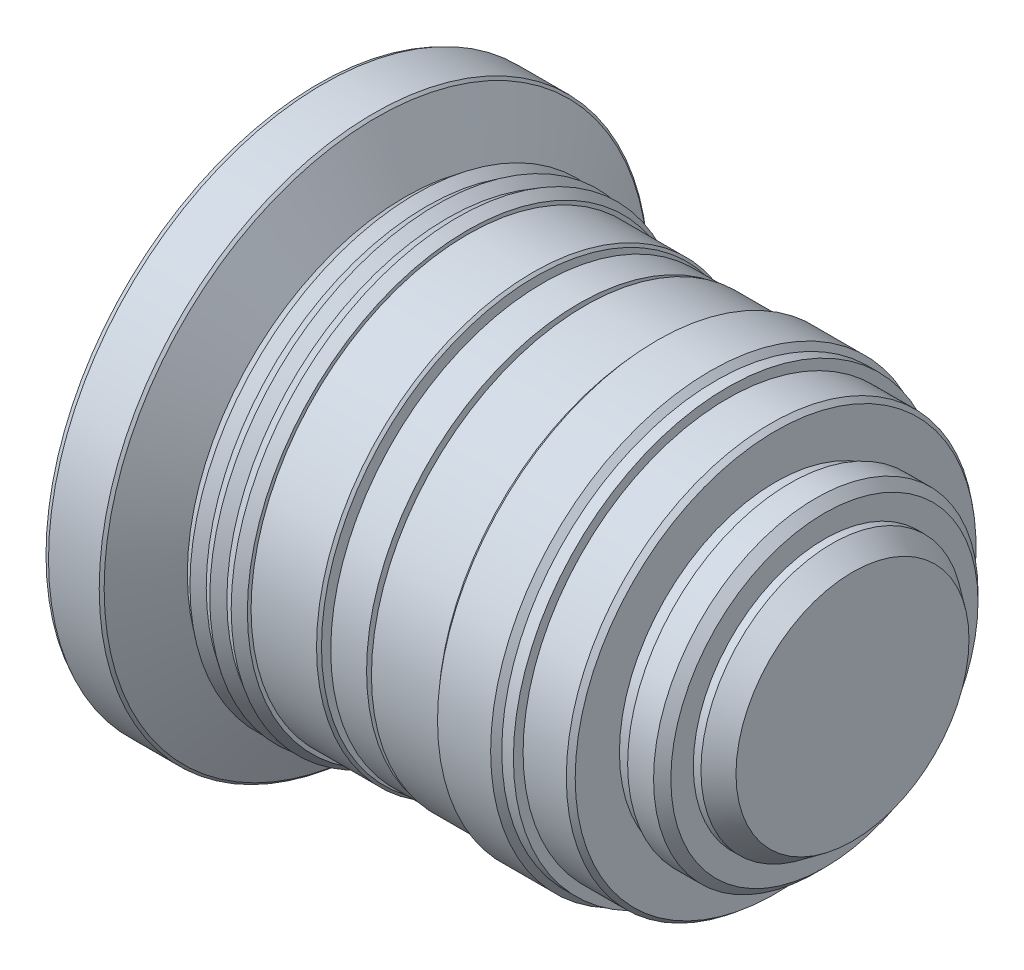
ISO-10303-21;
HEADER;
FILE_DESCRIPTION(('STEP AP214'),'2;1');
FILE_NAME('part.step','',(''),(''),'','','');
FILE_SCHEMA(('AUTOMOTIVE_DESIGN { 1 0 10303 214 1 1 1 1 }'));
ENDSEC;
DATA;
#1=APPLICATION_CONTEXT('core data for automotive mechanical design processes');
#2=APPLICATION_PROTOCOL_DEFINITION('international standard','automotive_design',2000,#1);
#3=PRODUCT_CONTEXT('',#1,'mechanical');
#4=PRODUCT('Part','Part','',(#3));
#5=PRODUCT_RELATED_PRODUCT_CATEGORY('part','',(#4));
#6=PRODUCT_DEFINITION_FORMATION('','',#4);
#7=PRODUCT_DEFINITION_CONTEXT('part definition',#1,'design');
#8=PRODUCT_DEFINITION('design','',#6,#7);
#9=PRODUCT_DEFINITION_SHAPE('','',#8);
#10=(LENGTH_UNIT() NAMED_UNIT(*) SI_UNIT(.MILLI.,.METRE.));
#11=(NAMED_UNIT(*) PLANE_ANGLE_UNIT() SI_UNIT($,.RADIAN.));
#12=(NAMED_UNIT(*) SI_UNIT($,.STERADIAN.) SOLID_ANGLE_UNIT());
#13=UNCERTAINTY_MEASURE_WITH_UNIT(LENGTH_MEASURE(1.E-05),#10,'distance_accuracy_value','');
#14=(GEOMETRIC_REPRESENTATION_CONTEXT(3) GLOBAL_UNCERTAINTY_ASSIGNED_CONTEXT((#13)) GLOBAL_UNIT_ASSIGNED_CONTEXT((#10,
#11,#12)) REPRESENTATION_CONTEXT('',''));
#15=CARTESIAN_POINT('',(0.,0.,0.));
#16=DIRECTION('',(0.,0.,1.));
#17=DIRECTION('',(1.,0.,0.));
#18=AXIS2_PLACEMENT_3D('',#15,#16,#17);
#19=CARTESIAN_POINT('',(0.,0.,0.));
#20=DIRECTION('',(-1.,0.,0.));
#21=DIRECTION('',(0.,0.,1.));
#22=AXIS2_PLACEMENT_3D('',#19,#20,#21);
#23=PLANE('',#22);
#24=CARTESIAN_POINT('',(0.,0.,0.));
#25=DIRECTION('',(-1.,0.,0.));
#26=DIRECTION('',(0.,0.,1.));
#27=AXIS2_PLACEMENT_3D('',#24,#25,#26);
#28=CIRCLE('',#27,22.2974391513907);
#29=CARTESIAN_POINT('',(0.,0.,22.2974391513907));
#30=VERTEX_POINT('',#29);
#31=EDGE_CURVE('E10',#30,#30,#28,.T.);
#32=ORIENTED_EDGE('',*,*,#31,.T.);
#33=EDGE_LOOP('',(#32));
#34=FACE_BOUND('',#33,.T.);
#35=ADVANCED_FACE('F35',(#34),#23,.T.);
#36=CARTESIAN_POINT('',(0.,0.,0.));
#37=DIRECTION('',(1.,0.,0.));
#38=DIRECTION('',(0.,0.,-1.));
#39=AXIS2_PLACEMENT_3D('',#36,#37,#38);
#40=CONICAL_SURFACE('',#39,22.2974391513907,0.461812950452293);
#41=CARTESIAN_POINT('',(0.406986692532814,0.,0.));
#42=DIRECTION('',(-1.,0.,0.));
#43=DIRECTION('',(0.,0.,1.));
#44=AXIS2_PLACEMENT_3D('',#41,#42,#43);
#45=CIRCLE('',#44,22.5);
#46=CARTESIAN_POINT('',(0.406986692532814,0.,22.5));
#47=VERTEX_POINT('',#46);
#48=EDGE_CURVE('E41',#47,#47,#45,.T.);
#49=ORIENTED_EDGE('',*,*,#48,.T.);
#50=EDGE_LOOP('',(#49));
#51=FACE_BOUND('',#50,.T.);
#52=ORIENTED_EDGE('',*,*,#31,.F.);
#53=EDGE_LOOP('',(#52));
#54=FACE_BOUND('',#53,.T.);
#55=ADVANCED_FACE('F166',(#51,#54),#40,.T.);
#56=CARTESIAN_POINT('',(0.,0.,0.));
#57=DIRECTION('',(-1.,0.,0.));
#58=DIRECTION('',(0.,0.,1.));
#59=AXIS2_PLACEMENT_3D('',#56,#57,#58);
#60=CYLINDRICAL_SURFACE('',#59,22.5);
#61=CARTESIAN_POINT('',(4.56317141778496,0.,0.));
#62=DIRECTION('',(-1.,0.,0.));
#63=DIRECTION('',(0.,0.,1.));
#64=AXIS2_PLACEMENT_3D('',#61,#62,#63);
#65=CIRCLE('',#64,22.5);
#66=CARTESIAN_POINT('',(4.56317141778496,0.,22.5));
#67=VERTEX_POINT('',#66);
#68=EDGE_CURVE('E45',#67,#67,#65,.T.);
#69=ORIENTED_EDGE('',*,*,#68,.T.);
#70=EDGE_LOOP('',(#69));
#71=FACE_BOUND('',#70,.T.);
#72=ORIENTED_EDGE('',*,*,#48,.F.);
#73=EDGE_LOOP('',(#72));
#74=FACE_BOUND('',#73,.T.);
#75=ADVANCED_FACE('F170',(#71,#74),#60,.T.);
#76=CARTESIAN_POINT('',(4.56317141778496,0.,0.));
#77=DIRECTION('',(-1.,0.,0.));
#78=DIRECTION('',(0.,0.,1.));
#79=AXIS2_PLACEMENT_3D('',#76,#77,#78);
#80=CONICAL_SURFACE('',#79,22.5,0.78582353690279);
#81=CARTESIAN_POINT('',(4.76556001162007,0.,0.));
#82=DIRECTION('',(-1.,0.,0.));
#83=DIRECTION('',(0.,0.,1.));
#84=AXIS2_PLACEMENT_3D('',#81,#82,#83);
#85=CIRCLE('',#84,22.2974391513907);
#86=CARTESIAN_POINT('',(4.76556001162007,0.,22.2974391513907));
#87=VERTEX_POINT('',#86);
#88=EDGE_CURVE('E49',#87,#87,#85,.T.);
#89=ORIENTED_EDGE('',*,*,#88,.T.);
#90=EDGE_LOOP('',(#89));
#91=FACE_BOUND('',#90,.T.);
#92=ORIENTED_EDGE('',*,*,#68,.F.);
#93=EDGE_LOOP('',(#92));
#94=FACE_BOUND('',#93,.T.);
#95=ADVANCED_FACE('F174',(#91,#94),#80,.T.);
#96=CARTESIAN_POINT('',(4.76556001162007,0.,0.));
#97=DIRECTION('',(-1.,0.,0.));
#98=DIRECTION('',(0.,0.,1.));
#99=AXIS2_PLACEMENT_3D('',#96,#97,#98);
#100=CONICAL_SURFACE('',#99,22.2974391513907,1.08197767740128);
#101=CARTESIAN_POINT('',(7.13257979435963,0.,0.));
#102=DIRECTION('',(-1.,0.,0.));
#103=DIRECTION('',(0.,0.,1.));
#104=AXIS2_PLACEMENT_3D('',#101,#102,#103);
#105=CIRCLE('',#104,17.8470801813691);
#106=CARTESIAN_POINT('',(7.13257979435963,0.,17.8470801813691));
#107=VERTEX_POINT('',#106);
#108=EDGE_CURVE('E54',#107,#107,#105,.T.);
#109=ORIENTED_EDGE('',*,*,#108,.T.);
#110=EDGE_LOOP('',(#109));
#111=FACE_BOUND('',#110,.T.);
#112=ORIENTED_EDGE('',*,*,#88,.F.);
#113=EDGE_LOOP('',(#112));
#114=FACE_BOUND('',#113,.T.);
#115=ADVANCED_FACE('F181',(#111,#114),#100,.T.);
#116=CARTESIAN_POINT('',(7.13257979435963,0.,0.));
#117=DIRECTION('',(1.,0.,0.));
#118=DIRECTION('',(0.,0.,-1.));
#119=AXIS2_PLACEMENT_3D('',#116,#117,#118);
#120=CONICAL_SURFACE('',#119,17.8470801813691,0.650657219482176);
#121=CARTESIAN_POINT('',(8.03407820436576,0.,0.));
#122=DIRECTION('',(-1.,0.,0.));
#123=DIRECTION('',(0.,0.,1.));
#124=AXIS2_PLACEMENT_3D('',#121,#122,#123);
#125=CIRCLE('',#124,18.5333385901302);
#126=CARTESIAN_POINT('',(8.03407820436576,0.,18.5333385901302));
#127=VERTEX_POINT('',#126);
#128=EDGE_CURVE('E57',#127,#127,#125,.T.);
#129=ORIENTED_EDGE('',*,*,#128,.T.);
#130=EDGE_LOOP('',(#129));
#131=FACE_BOUND('',#130,.T.);
#132=ORIENTED_EDGE('',*,*,#108,.F.);
#133=EDGE_LOOP('',(#132));
#134=FACE_BOUND('',#133,.T.);
#135=ADVANCED_FACE('F185',(#131,#134),#120,.T.);
#136=CARTESIAN_POINT('',(8.03407820436576,0.,0.));
#137=DIRECTION('',(-1.,0.,0.));
#138=DIRECTION('',(0.,0.,1.));
#139=AXIS2_PLACEMENT_3D('',#136,#137,#138);
#140=CONICAL_SURFACE('',#139,18.5333385901302,0.523346117596078);
#141=CARTESIAN_POINT('',(8.87951001940779,0.,0.));
#142=DIRECTION('',(-1.,0.,0.));
#143=DIRECTION('',(0.,0.,1.));
#144=AXIS2_PLACEMENT_3D('',#141,#142,#143);
#145=CIRCLE('',#144,18.0455130694188);
#146=CARTESIAN_POINT('',(8.87951001940779,0.,18.0455130694188));
#147=VERTEX_POINT('',#146);
#148=EDGE_CURVE('E60',#147,#147,#145,.T.);
#149=ORIENTED_EDGE('',*,*,#148,.T.);
#150=EDGE_LOOP('',(#149));
#151=FACE_BOUND('',#150,.T.);
#152=ORIENTED_EDGE('',*,*,#128,.F.);
#153=EDGE_LOOP('',(#152));
#154=FACE_BOUND('',#153,.T.);
#155=ADVANCED_FACE('F189',(#151,#154),#140,.T.);
#156=CARTESIAN_POINT('',(8.87951001940779,0.,0.));
#157=DIRECTION('',(1.,0.,0.));
#158=DIRECTION('',(0.,0.,-1.));
#159=AXIS2_PLACEMENT_3D('',#156,#157,#158);
#160=CONICAL_SURFACE('',#159,18.0455130694188,0.581481627477008);
#161=CARTESIAN_POINT('',(9.72476957967552,0.,0.));
#162=DIRECTION('',(-1.,0.,0.));
#163=DIRECTION('',(0.,0.,1.));
#164=AXIS2_PLACEMENT_3D('',#161,#162,#163);
#165=CIRCLE('',#164,18.6010921346732);
#166=CARTESIAN_POINT('',(9.72476957967552,0.,18.6010921346732));
#167=VERTEX_POINT('',#166);
#168=EDGE_CURVE('E63',#167,#167,#165,.T.);
#169=ORIENTED_EDGE('',*,*,#168,.T.);
#170=EDGE_LOOP('',(#169));
#171=FACE_BOUND('',#170,.T.);
#172=ORIENTED_EDGE('',*,*,#148,.F.);
#173=EDGE_LOOP('',(#172));
#174=FACE_BOUND('',#173,.T.);
#175=ADVANCED_FACE('F193',(#171,#174),#160,.T.);
#176=CARTESIAN_POINT('',(9.72476957967552,0.,0.));
#177=DIRECTION('',(-1.,0.,0.));
#178=DIRECTION('',(0.,0.,1.));
#179=AXIS2_PLACEMENT_3D('',#176,#177,#178);
#180=CONICAL_SURFACE('',#179,18.6010921346732,0.581484550535409);
#181=CARTESIAN_POINT('',(10.5700237569816,0.,0.));
#182=DIRECTION('',(-1.,0.,0.));
#183=DIRECTION('',(0.,0.,1.));
#184=AXIS2_PLACEMENT_3D('',#181,#182,#183);
#185=CIRCLE('',#184,18.0455130694189);
#186=CARTESIAN_POINT('',(10.5700237569816,0.,18.0455130694189));
#187=VERTEX_POINT('',#186);
#188=EDGE_CURVE('E66',#187,#187,#185,.T.);
#189=ORIENTED_EDGE('',*,*,#188,.T.);
#190=EDGE_LOOP('',(#189));
#191=FACE_BOUND('',#190,.T.);
#192=ORIENTED_EDGE('',*,*,#168,.F.);
#193=EDGE_LOOP('',(#192));
#194=FACE_BOUND('',#193,.T.);
#195=ADVANCED_FACE('F197',(#191,#194),#180,.T.);
#196=CARTESIAN_POINT('',(10.5700237569816,0.,0.));
#197=DIRECTION('',(1.,0.,0.));
#198=DIRECTION('',(0.,0.,-1.));
#199=AXIS2_PLACEMENT_3D('',#196,#197,#198);
#200=CONICAL_SURFACE('',#199,18.0455130694189,0.523558723699573);
#201=CARTESIAN_POINT('',(11.4102663969489,0.,0.));
#202=DIRECTION('',(-1.,0.,0.));
#203=DIRECTION('',(0.,0.,1.));
#204=AXIS2_PLACEMENT_3D('',#201,#202,#203);
#205=CIRCLE('',#204,18.530582513742);
#206=CARTESIAN_POINT('',(11.4102663969489,0.,18.530582513742));
#207=VERTEX_POINT('',#206);
#208=EDGE_CURVE('E69',#207,#207,#205,.T.);
#209=ORIENTED_EDGE('',*,*,#208,.T.);
#210=EDGE_LOOP('',(#209));
#211=FACE_BOUND('',#210,.T.);
#212=ORIENTED_EDGE('',*,*,#188,.F.);
#213=EDGE_LOOP('',(#212));
#214=FACE_BOUND('',#213,.T.);
#215=ADVANCED_FACE('F201',(#211,#214),#200,.T.);
#216=CARTESIAN_POINT('',(11.4102663969489,0.,0.));
#217=DIRECTION('',(-1.,0.,0.));
#218=DIRECTION('',(0.,0.,1.));
#219=AXIS2_PLACEMENT_3D('',#216,#217,#218);
#220=CONICAL_SURFACE('',#219,18.530582513742,0.523447787407338);
#221=CARTESIAN_POINT('',(12.2507243553841,0.,0.));
#222=DIRECTION('',(-1.,0.,0.));
#223=DIRECTION('',(0.,0.,1.));
#224=AXIS2_PLACEMENT_3D('',#221,#222,#223);
#225=CIRCLE('',#224,18.0455130694188);
#226=CARTESIAN_POINT('',(12.2507243553841,0.,18.0455130694188));
#227=VERTEX_POINT('',#226);
#228=EDGE_CURVE('E72',#227,#227,#225,.T.);
#229=ORIENTED_EDGE('',*,*,#228,.T.);
#230=EDGE_LOOP('',(#229));
#231=FACE_BOUND('',#230,.T.);
#232=ORIENTED_EDGE('',*,*,#208,.F.);
#233=EDGE_LOOP('',(#232));
#234=FACE_BOUND('',#233,.T.);
#235=ADVANCED_FACE('F205',(#231,#234),#220,.T.);
#236=CARTESIAN_POINT('',(12.2507243553841,-18.0455130694188,0.));
#237=DIRECTION('',(1.,0.,0.));
#238=DIRECTION('',(0.,0.,-1.));
#239=AXIS2_PLACEMENT_3D('',#236,#237,#238);
#240=PLANE('',#239);
#241=CARTESIAN_POINT('',(12.2507243553841,0.,0.));
#242=DIRECTION('',(-1.,0.,0.));
#243=DIRECTION('',(0.,0.,1.));
#244=AXIS2_PLACEMENT_3D('',#241,#242,#243);
#245=CIRCLE('',#244,17.7416664135432);
#246=CARTESIAN_POINT('',(12.2507243553841,0.,17.7416664135432));
#247=VERTEX_POINT('',#246);
#248=EDGE_CURVE('E75',#247,#247,#245,.T.);
#249=ORIENTED_EDGE('',*,*,#248,.T.);
#250=EDGE_LOOP('',(#249));
#251=FACE_BOUND('',#250,.T.);
#252=ORIENTED_EDGE('',*,*,#228,.F.);
#253=EDGE_LOOP('',(#252));
#254=FACE_BOUND('',#253,.T.);
#255=ADVANCED_FACE('F209',(#251,#254),#240,.T.);
#256=CARTESIAN_POINT('',(0.,0.,0.));
#257=DIRECTION('',(-1.,0.,0.));
#258=DIRECTION('',(0.,0.,1.));
#259=AXIS2_PLACEMENT_3D('',#256,#257,#258);
#260=CYLINDRICAL_SURFACE('',#259,17.7416664135432);
#261=CARTESIAN_POINT('',(17.6162667870397,0.,0.));
#262=DIRECTION('',(-1.,0.,0.));
#263=DIRECTION('',(0.,0.,1.));
#264=AXIS2_PLACEMENT_3D('',#261,#262,#263);
#265=CIRCLE('',#264,17.7416664135432);
#266=CARTESIAN_POINT('',(17.6162667870397,0.,17.7416664135432));
#267=VERTEX_POINT('',#266);
#268=EDGE_CURVE('E78',#267,#267,#265,.T.);
#269=ORIENTED_EDGE('',*,*,#268,.T.);
#270=EDGE_LOOP('',(#269));
#271=FACE_BOUND('',#270,.T.);
#272=ORIENTED_EDGE('',*,*,#248,.F.);
#273=EDGE_LOOP('',(#272));
#274=FACE_BOUND('',#273,.T.);
#275=ADVANCED_FACE('F213',(#271,#274),#260,.T.);
#276=CARTESIAN_POINT('',(17.6162667870397,0.,0.));
#277=DIRECTION('',(-1.,0.,0.));
#278=DIRECTION('',(0.,0.,1.));
#279=AXIS2_PLACEMENT_3D('',#276,#277,#278);
#280=CONICAL_SURFACE('',#279,17.7416664135432,0.785411448020408);
#281=CARTESIAN_POINT('',(17.8188653163808,0.,0.));
#282=DIRECTION('',(-1.,0.,0.));
#283=DIRECTION('',(0.,0.,1.));
#284=AXIS2_PLACEMENT_3D('',#281,#282,#283);
#285=CIRCLE('',#284,17.5390625012403);
#286=CARTESIAN_POINT('',(17.8188653163808,0.,17.5390625012403));
#287=VERTEX_POINT('',#286);
#288=EDGE_CURVE('E81',#287,#287,#285,.T.);
#289=ORIENTED_EDGE('',*,*,#288,.T.);
#290=EDGE_LOOP('',(#289));
#291=FACE_BOUND('',#290,.T.);
#292=ORIENTED_EDGE('',*,*,#268,.F.);
#293=EDGE_LOOP('',(#292));
#294=FACE_BOUND('',#293,.T.);
#295=ADVANCED_FACE('F217',(#291,#294),#280,.T.);
#296=CARTESIAN_POINT('',(17.8188653163808,-17.5390625012403,0.));
#297=DIRECTION('',(1.,0.,0.));
#298=DIRECTION('',(0.,0.,-1.));
#299=AXIS2_PLACEMENT_3D('',#296,#297,#298);
#300=PLANE('',#299);
#301=CARTESIAN_POINT('',(17.8188653163808,0.,0.));
#302=DIRECTION('',(-1.,0.,0.));
#303=DIRECTION('',(0.,0.,1.));
#304=AXIS2_PLACEMENT_3D('',#301,#302,#303);
#305=CIRCLE('',#304,16.4256291722543);
#306=CARTESIAN_POINT('',(17.8188653163808,0.,16.4256291722543));
#307=VERTEX_POINT('',#306);
#308=EDGE_CURVE('E84',#307,#307,#305,.T.);
#309=ORIENTED_EDGE('',*,*,#308,.T.);
#310=EDGE_LOOP('',(#309));
#311=FACE_BOUND('',#310,.T.);
#312=ORIENTED_EDGE('',*,*,#288,.F.);
#313=EDGE_LOOP('',(#312));
#314=FACE_BOUND('',#313,.T.);
#315=ADVANCED_FACE('F221',(#311,#314),#300,.T.);
#316=CARTESIAN_POINT('',(0.,0.,0.));
#317=DIRECTION('',(-1.,0.,0.));
#318=DIRECTION('',(0.,0.,1.));
#319=AXIS2_PLACEMENT_3D('',#316,#317,#318);
#320=CYLINDRICAL_SURFACE('',#319,16.4256291722543);
#321=CARTESIAN_POINT('',(18.4260310978859,0.,0.));
#322=DIRECTION('',(-1.,0.,0.));
#323=DIRECTION('',(0.,0.,1.));
#324=AXIS2_PLACEMENT_3D('',#321,#322,#323);
#325=CIRCLE('',#324,16.4256291722543);
#326=CARTESIAN_POINT('',(18.4260310978859,0.,16.4256291722543));
#327=VERTEX_POINT('',#326);
#328=EDGE_CURVE('E87',#327,#327,#325,.T.);
#329=ORIENTED_EDGE('',*,*,#328,.T.);
#330=EDGE_LOOP('',(#329));
#331=FACE_BOUND('',#330,.T.);
#332=ORIENTED_EDGE('',*,*,#308,.F.);
#333=EDGE_LOOP('',(#332));
#334=FACE_BOUND('',#333,.T.);
#335=ADVANCED_FACE('F225',(#331,#334),#320,.T.);
#336=CARTESIAN_POINT('',(18.4260310978859,-16.4256291722543,0.));
#337=DIRECTION('',(-1.,0.,0.));
#338=DIRECTION('',(0.,0.,1.));
#339=AXIS2_PLACEMENT_3D('',#336,#337,#338);
#340=PLANE('',#339);
#341=CARTESIAN_POINT('',(18.4260310978859,0.,0.));
#342=DIRECTION('',(-1.,0.,0.));
#343=DIRECTION('',(0.,0.,1.));
#344=AXIS2_PLACEMENT_3D('',#341,#342,#343);
#345=CIRCLE('',#344,17.3871445562642);
#346=CARTESIAN_POINT('',(18.4260310978859,0.,17.3871445562642));
#347=VERTEX_POINT('',#346);
#348=EDGE_CURVE('E90',#347,#347,#345,.T.);
#349=ORIENTED_EDGE('',*,*,#348,.T.);
#350=EDGE_LOOP('',(#349));
#351=FACE_BOUND('',#350,.T.);
#352=ORIENTED_EDGE('',*,*,#328,.F.);
#353=EDGE_LOOP('',(#352));
#354=FACE_BOUND('',#353,.T.);
#355=ADVANCED_FACE('F229',(#351,#354),#340,.T.);
#356=CARTESIAN_POINT('',(0.,0.,0.));
#357=DIRECTION('',(-1.,0.,0.));
#358=DIRECTION('',(0.,0.,1.));
#359=AXIS2_PLACEMENT_3D('',#356,#357,#358);
#360=CYLINDRICAL_SURFACE('',#359,17.3871445562642);
#361=CARTESIAN_POINT('',(21.3621298740752,0.,0.));
#362=DIRECTION('',(-1.,0.,0.));
#363=DIRECTION('',(0.,0.,1.));
#364=AXIS2_PLACEMENT_3D('',#361,#362,#363);
#365=CIRCLE('',#364,17.3871445562642);
#366=CARTESIAN_POINT('',(21.3621298740752,0.,17.3871445562642));
#367=VERTEX_POINT('',#366);
#368=EDGE_CURVE('E93',#367,#367,#365,.T.);
#369=ORIENTED_EDGE('',*,*,#368,.T.);
#370=EDGE_LOOP('',(#369));
#371=FACE_BOUND('',#370,.T.);
#372=ORIENTED_EDGE('',*,*,#348,.F.);
#373=EDGE_LOOP('',(#372));
#374=FACE_BOUND('',#373,.T.);
#375=ADVANCED_FACE('F233',(#371,#374),#360,.T.);
#376=CARTESIAN_POINT('',(21.3621298740752,-17.3871445562642,0.));
#377=DIRECTION('',(1.,0.,0.));
#378=DIRECTION('',(0.,0.,-1.));
#379=AXIS2_PLACEMENT_3D('',#376,#377,#378);
#380=PLANE('',#379);
#381=CARTESIAN_POINT('',(21.3621298740752,0.,0.));
#382=DIRECTION('',(-1.,0.,0.));
#383=DIRECTION('',(0.,0.,1.));
#384=AXIS2_PLACEMENT_3D('',#381,#382,#383);
#385=CIRCLE('',#384,16.4256291722543);
#386=CARTESIAN_POINT('',(21.3621298740752,0.,16.4256291722543));
#387=VERTEX_POINT('',#386);
#388=EDGE_CURVE('E96',#387,#387,#385,.T.);
#389=ORIENTED_EDGE('',*,*,#388,.T.);
#390=EDGE_LOOP('',(#389));
#391=FACE_BOUND('',#390,.T.);
#392=ORIENTED_EDGE('',*,*,#368,.F.);
#393=EDGE_LOOP('',(#392));
#394=FACE_BOUND('',#393,.T.);
#395=ADVANCED_FACE('F237',(#391,#394),#380,.T.);
#396=CARTESIAN_POINT('',(0.,0.,0.));
#397=DIRECTION('',(-1.,0.,0.));
#398=DIRECTION('',(0.,0.,1.));
#399=AXIS2_PLACEMENT_3D('',#396,#397,#398);
#400=CYLINDRICAL_SURFACE('',#399,16.4256291722543);
#401=CARTESIAN_POINT('',(21.8682251667818,0.,0.));
#402=DIRECTION('',(-1.,0.,0.));
#403=DIRECTION('',(0.,0.,1.));
#404=AXIS2_PLACEMENT_3D('',#401,#402,#403);
#405=CIRCLE('',#404,16.4256291722543);
#406=CARTESIAN_POINT('',(21.8682251667818,0.,16.4256291722543));
#407=VERTEX_POINT('',#406);
#408=EDGE_CURVE('E99',#407,#407,#405,.T.);
#409=ORIENTED_EDGE('',*,*,#408,.T.);
#410=EDGE_LOOP('',(#409));
#411=FACE_BOUND('',#410,.T.);
#412=ORIENTED_EDGE('',*,*,#388,.F.);
#413=EDGE_LOOP('',(#412));
#414=FACE_BOUND('',#413,.T.);
#415=ADVANCED_FACE('F241',(#411,#414),#400,.T.);
#416=CARTESIAN_POINT('',(21.8682251667818,-16.4256291722543,0.));
#417=DIRECTION('',(-1.,0.,0.));
#418=DIRECTION('',(0.,0.,1.));
#419=AXIS2_PLACEMENT_3D('',#416,#417,#418);
#420=PLANE('',#419);
#421=CARTESIAN_POINT('',(21.8682251667818,0.,0.));
#422=DIRECTION('',(-1.,0.,0.));
#423=DIRECTION('',(0.,0.,1.));
#424=AXIS2_PLACEMENT_3D('',#421,#422,#423);
#425=CIRCLE('',#424,17.4938939413699);
#426=CARTESIAN_POINT('',(21.8682251667818,0.,17.4938939413699));
#427=VERTEX_POINT('',#426);
#428=EDGE_CURVE('E102',#427,#427,#425,.T.);
#429=ORIENTED_EDGE('',*,*,#428,.T.);
#430=EDGE_LOOP('',(#429));
#431=FACE_BOUND('',#430,.T.);
#432=ORIENTED_EDGE('',*,*,#408,.F.);
#433=EDGE_LOOP('',(#432));
#434=FACE_BOUND('',#433,.T.);
#435=ADVANCED_FACE('F245',(#431,#434),#420,.T.);
#436=CARTESIAN_POINT('',(0.,0.,0.));
#437=DIRECTION('',(-1.,0.,0.));
#438=DIRECTION('',(0.,0.,1.));
#439=AXIS2_PLACEMENT_3D('',#436,#437,#438);
#440=CYLINDRICAL_SURFACE('',#439,17.4938939413699);
#441=CARTESIAN_POINT('',(27.3349026827762,0.,0.));
#442=DIRECTION('',(-1.,0.,0.));
#443=DIRECTION('',(0.,0.,1.));
#444=AXIS2_PLACEMENT_3D('',#441,#442,#443);
#445=CIRCLE('',#444,17.4938939413699);
#446=CARTESIAN_POINT('',(27.3349026827762,0.,17.4938939413699));
#447=VERTEX_POINT('',#446);
#448=EDGE_CURVE('E105',#447,#447,#445,.T.);
#449=ORIENTED_EDGE('',*,*,#448,.T.);
#450=EDGE_LOOP('',(#449));
#451=FACE_BOUND('',#450,.T.);
#452=ORIENTED_EDGE('',*,*,#428,.F.);
#453=EDGE_LOOP('',(#452));
#454=FACE_BOUND('',#453,.T.);
#455=ADVANCED_FACE('F249',(#451,#454),#440,.T.);
#456=CARTESIAN_POINT('',(27.3349026827762,0.,0.));
#457=DIRECTION('',(1.,0.,0.));
#458=DIRECTION('',(0.,0.,-1.));
#459=AXIS2_PLACEMENT_3D('',#456,#457,#458);
#460=CONICAL_SURFACE('',#459,17.4938939413699,0.837663997446981);
#461=CARTESIAN_POINT('',(27.7906888154749,0.,0.));
#462=DIRECTION('',(-1.,0.,0.));
#463=DIRECTION('',(0.,0.,1.));
#464=AXIS2_PLACEMENT_3D('',#461,#462,#463);
#465=CIRCLE('',#464,18.);
#466=CARTESIAN_POINT('',(27.7906888154749,0.,18.));
#467=VERTEX_POINT('',#466);
#468=EDGE_CURVE('E108',#467,#467,#465,.T.);
#469=ORIENTED_EDGE('',*,*,#468,.T.);
#470=EDGE_LOOP('',(#469));
#471=FACE_BOUND('',#470,.T.);
#472=ORIENTED_EDGE('',*,*,#448,.F.);
#473=EDGE_LOOP('',(#472));
#474=FACE_BOUND('',#473,.T.);
#475=ADVANCED_FACE('F253',(#471,#474),#460,.T.);
#476=CARTESIAN_POINT('',(0.,0.,0.));
#477=DIRECTION('',(-1.,0.,0.));
#478=DIRECTION('',(0.,0.,1.));
#479=AXIS2_PLACEMENT_3D('',#476,#477,#478);
#480=CYLINDRICAL_SURFACE('',#479,18.);
#481=CARTESIAN_POINT('',(32.1439007047131,0.,0.));
#482=DIRECTION('',(-1.,0.,0.));
#483=DIRECTION('',(0.,0.,1.));
#484=AXIS2_PLACEMENT_3D('',#481,#482,#483);
#485=CIRCLE('',#484,18.);
#486=CARTESIAN_POINT('',(32.1439007047131,0.,18.));
#487=VERTEX_POINT('',#486);
#488=EDGE_CURVE('E111',#487,#487,#485,.T.);
#489=ORIENTED_EDGE('',*,*,#488,.T.);
#490=EDGE_LOOP('',(#489));
#491=FACE_BOUND('',#490,.T.);
#492=ORIENTED_EDGE('',*,*,#468,.F.);
#493=EDGE_LOOP('',(#492));
#494=FACE_BOUND('',#493,.T.);
#495=ADVANCED_FACE('F257',(#491,#494),#480,.T.);
#496=CARTESIAN_POINT('',(32.1439007047131,0.,0.));
#497=DIRECTION('',(-1.,0.,0.));
#498=DIRECTION('',(0.,0.,1.));
#499=AXIS2_PLACEMENT_3D('',#496,#497,#498);
#500=CONICAL_SURFACE('',#499,18.,0.785433620618303);
#501=CARTESIAN_POINT('',(32.5993315619397,0.,0.));
#502=DIRECTION('',(-1.,0.,0.));
#503=DIRECTION('',(0.,0.,1.));
#504=AXIS2_PLACEMENT_3D('',#501,#502,#503);
#505=CIRCLE('',#504,17.5445368450032);
#506=CARTESIAN_POINT('',(32.5993315619397,0.,17.5445368450032));
#507=VERTEX_POINT('',#506);
#508=EDGE_CURVE('E114',#507,#507,#505,.T.);
#509=ORIENTED_EDGE('',*,*,#508,.T.);
#510=EDGE_LOOP('',(#509));
#511=FACE_BOUND('',#510,.T.);
#512=ORIENTED_EDGE('',*,*,#488,.F.);
#513=EDGE_LOOP('',(#512));
#514=FACE_BOUND('',#513,.T.);
#515=ADVANCED_FACE('F261',(#511,#514),#500,.T.);
#516=CARTESIAN_POINT('',(0.,0.,0.));
#517=DIRECTION('',(-1.,0.,0.));
#518=DIRECTION('',(0.,0.,1.));
#519=AXIS2_PLACEMENT_3D('',#516,#517,#518);
#520=CYLINDRICAL_SURFACE('',#519,17.5445368450032);
#521=CARTESIAN_POINT('',(33.5524027328355,0.,0.));
#522=DIRECTION('',(-1.,0.,0.));
#523=DIRECTION('',(0.,0.,1.));
#524=AXIS2_PLACEMENT_3D('',#521,#522,#523);
#525=CIRCLE('',#524,17.5445368450032);
#526=CARTESIAN_POINT('',(33.5524027328355,0.,17.5445368450032));
#527=VERTEX_POINT('',#526);
#528=EDGE_CURVE('E117',#527,#527,#525,.T.);
#529=ORIENTED_EDGE('',*,*,#528,.T.);
#530=EDGE_LOOP('',(#529));
#531=FACE_BOUND('',#530,.T.);
#532=ORIENTED_EDGE('',*,*,#508,.F.);
#533=EDGE_LOOP('',(#532));
#534=FACE_BOUND('',#533,.T.);
#535=ADVANCED_FACE('F265',(#531,#534),#520,.T.);
#536=CARTESIAN_POINT('',(33.5524027328355,0.,0.));
#537=DIRECTION('',(1.,0.,0.));
#538=DIRECTION('',(0.,0.,-1.));
#539=AXIS2_PLACEMENT_3D('',#536,#537,#538);
#540=CONICAL_SURFACE('',#539,17.5445368450032,1.57071492643055);
#541=CARTESIAN_POINT('',(33.5523380572466,0.,0.));
#542=DIRECTION('',(-1.,0.,0.));
#543=DIRECTION('',(0.,0.,1.));
#544=AXIS2_PLACEMENT_3D('',#541,#542,#543);
#545=CIRCLE('',#544,16.75);
#546=CARTESIAN_POINT('',(33.5523380572466,0.,16.75));
#547=VERTEX_POINT('',#546);
#548=EDGE_CURVE('E120',#547,#547,#545,.T.);
#549=ORIENTED_EDGE('',*,*,#548,.T.);
#550=EDGE_LOOP('',(#549));
#551=FACE_BOUND('',#550,.T.);
#552=ORIENTED_EDGE('',*,*,#528,.F.);
#553=EDGE_LOOP('',(#552));
#554=FACE_BOUND('',#553,.T.);
#555=ADVANCED_FACE('F269',(#551,#554),#540,.F.);
#556=CARTESIAN_POINT('',(0.,0.,0.));
#557=DIRECTION('',(-1.,0.,0.));
#558=DIRECTION('',(0.,0.,1.));
#559=AXIS2_PLACEMENT_3D('',#556,#557,#558);
#560=CYLINDRICAL_SURFACE('',#559,16.75);
#561=CARTESIAN_POINT('',(37.0951133565682,0.,0.));
#562=DIRECTION('',(-1.,0.,0.));
#563=DIRECTION('',(0.,0.,1.));
#564=AXIS2_PLACEMENT_3D('',#561,#562,#563);
#565=CIRCLE('',#564,16.75);
#566=CARTESIAN_POINT('',(37.0951133565682,0.,16.75));
#567=VERTEX_POINT('',#566);
#568=EDGE_CURVE('E123',#567,#567,#565,.T.);
#569=ORIENTED_EDGE('',*,*,#568,.T.);
#570=EDGE_LOOP('',(#569));
#571=FACE_BOUND('',#570,.T.);
#572=ORIENTED_EDGE('',*,*,#548,.F.);
#573=EDGE_LOOP('',(#572));
#574=FACE_BOUND('',#573,.T.);
#575=ADVANCED_FACE('F273',(#571,#574),#560,.T.);
#576=CARTESIAN_POINT('',(37.0951133565682,0.,0.));
#577=DIRECTION('',(-1.,0.,0.));
#578=DIRECTION('',(0.,0.,1.));
#579=AXIS2_PLACEMENT_3D('',#576,#577,#578);
#580=CONICAL_SURFACE('',#579,16.75,0.675435590812794);
#581=CARTESIAN_POINT('',(37.5,0.,0.));
#582=DIRECTION('',(-1.,0.,0.));
#583=DIRECTION('',(0.,0.,1.));
#584=AXIS2_PLACEMENT_3D('',#581,#582,#583);
#585=CIRCLE('',#584,16.4256291722543);
#586=CARTESIAN_POINT('',(37.5,0.,16.4256291722543));
#587=VERTEX_POINT('',#586);
#588=EDGE_CURVE('E126',#587,#587,#585,.T.);
#589=ORIENTED_EDGE('',*,*,#588,.T.);
#590=EDGE_LOOP('',(#589));
#591=FACE_BOUND('',#590,.T.);
#592=ORIENTED_EDGE('',*,*,#568,.F.);
#593=EDGE_LOOP('',(#592));
#594=FACE_BOUND('',#593,.T.);
#595=ADVANCED_FACE('F277',(#591,#594),#580,.T.);
#596=CARTESIAN_POINT('',(37.5,-16.4256291722543,0.));
#597=DIRECTION('',(1.,0.,0.));
#598=DIRECTION('',(0.,0.,-1.));
#599=AXIS2_PLACEMENT_3D('',#596,#597,#598);
#600=PLANE('',#599);
#601=CARTESIAN_POINT('',(37.5,0.,0.));
#602=DIRECTION('',(-1.,0.,0.));
#603=DIRECTION('',(0.,0.,1.));
#604=AXIS2_PLACEMENT_3D('',#601,#602,#603);
#605=CIRCLE('',#604,12.8016915594812);
#606=CARTESIAN_POINT('',(37.5,0.,12.8016915594812));
#607=VERTEX_POINT('',#606);
#608=EDGE_CURVE('E129',#607,#607,#605,.T.);
#609=ORIENTED_EDGE('',*,*,#608,.T.);
#610=EDGE_LOOP('',(#609));
#611=FACE_BOUND('',#610,.T.);
#612=ORIENTED_EDGE('',*,*,#588,.F.);
#613=EDGE_LOOP('',(#612));
#614=FACE_BOUND('',#613,.T.);
#615=ADVANCED_FACE('F281',(#611,#614),#600,.T.);
#616=CARTESIAN_POINT('',(0.,0.,0.));
#617=DIRECTION('',(-1.,0.,0.));
#618=DIRECTION('',(0.,0.,1.));
#619=AXIS2_PLACEMENT_3D('',#616,#617,#618);
#620=CYLINDRICAL_SURFACE('',#619,12.8016915594812);
#621=CARTESIAN_POINT('',(38.6653646688131,0.,0.));
#622=DIRECTION('',(-1.,0.,0.));
#623=DIRECTION('',(0.,0.,1.));
#624=AXIS2_PLACEMENT_3D('',#621,#622,#623);
#625=CIRCLE('',#624,12.8016915594812);
#626=CARTESIAN_POINT('',(38.6653646688131,0.,12.8016915594812));
#627=VERTEX_POINT('',#626);
#628=EDGE_CURVE('E132',#627,#627,#625,.T.);
#629=ORIENTED_EDGE('',*,*,#628,.T.);
#630=EDGE_LOOP('',(#629));
#631=FACE_BOUND('',#630,.T.);
#632=ORIENTED_EDGE('',*,*,#608,.F.);
#633=EDGE_LOOP('',(#632));
#634=FACE_BOUND('',#633,.T.);
#635=ADVANCED_FACE('F285',(#631,#634),#620,.T.);
#636=CARTESIAN_POINT('',(38.6653646688131,-12.8016915594812,0.));
#637=DIRECTION('',(-1.,0.,0.));
#638=DIRECTION('',(0.,0.,1.));
#639=AXIS2_PLACEMENT_3D('',#636,#637,#638);
#640=PLANE('',#639);
#641=CARTESIAN_POINT('',(38.6653646688131,0.,0.));
#642=DIRECTION('',(-1.,0.,0.));
#643=DIRECTION('',(0.,0.,1.));
#644=AXIS2_PLACEMENT_3D('',#641,#642,#643);
#645=CIRCLE('',#644,13.2943079161017);
#646=CARTESIAN_POINT('',(38.6653646688131,0.,13.2943079161017));
#647=VERTEX_POINT('',#646);
#648=EDGE_CURVE('E135',#647,#647,#645,.T.);
#649=ORIENTED_EDGE('',*,*,#648,.T.);
#650=EDGE_LOOP('',(#649));
#651=FACE_BOUND('',#650,.T.);
#652=ORIENTED_EDGE('',*,*,#628,.F.);
#653=EDGE_LOOP('',(#652));
#654=FACE_BOUND('',#653,.T.);
#655=ADVANCED_FACE('F289',(#651,#654),#640,.T.);
#656=CARTESIAN_POINT('',(0.,0.,0.));
#657=DIRECTION('',(-1.,0.,0.));
#658=DIRECTION('',(0.,0.,1.));
#659=AXIS2_PLACEMENT_3D('',#656,#657,#658);
#660=CYLINDRICAL_SURFACE('',#659,13.2943079161017);
#661=CARTESIAN_POINT('',(40.7913438586841,0.,0.));
#662=DIRECTION('',(-1.,0.,0.));
#663=DIRECTION('',(0.,0.,1.));
#664=AXIS2_PLACEMENT_3D('',#661,#662,#663);
#665=CIRCLE('',#664,13.2943079161017);
#666=CARTESIAN_POINT('',(40.7913438586841,0.,13.2943079161017));
#667=VERTEX_POINT('',#666);
#668=EDGE_CURVE('E138',#667,#667,#665,.T.);
#669=ORIENTED_EDGE('',*,*,#668,.T.);
#670=EDGE_LOOP('',(#669));
#671=FACE_BOUND('',#670,.T.);
#672=ORIENTED_EDGE('',*,*,#648,.F.);
#673=EDGE_LOOP('',(#672));
#674=FACE_BOUND('',#673,.T.);
#675=ADVANCED_FACE('F293',(#671,#674),#660,.T.);
#676=CARTESIAN_POINT('',(40.7913438586841,0.,0.));
#677=DIRECTION('',(-1.,0.,0.));
#678=DIRECTION('',(0.,0.,1.));
#679=AXIS2_PLACEMENT_3D('',#676,#677,#678);
#680=CONICAL_SURFACE('',#679,13.2943079161017,0.784653199643181);
#681=CARTESIAN_POINT('',(41.5,0.,0.));
#682=DIRECTION('',(-1.,0.,0.));
#683=DIRECTION('',(0.,0.,1.));
#684=AXIS2_PLACEMENT_3D('',#681,#682,#683);
#685=CIRCLE('',#684,12.5867068352782);
#686=CARTESIAN_POINT('',(41.5,0.,12.5867068352782));
#687=VERTEX_POINT('',#686);
#688=EDGE_CURVE('E141',#687,#687,#685,.T.);
#689=ORIENTED_EDGE('',*,*,#688,.T.);
#690=EDGE_LOOP('',(#689));
#691=FACE_BOUND('',#690,.T.);
#692=ORIENTED_EDGE('',*,*,#668,.F.);
#693=EDGE_LOOP('',(#692));
#694=FACE_BOUND('',#693,.T.);
#695=ADVANCED_FACE('F297',(#691,#694),#680,.T.);
#696=CARTESIAN_POINT('',(41.5,-12.5867068352782,0.));
#697=DIRECTION('',(1.,0.,0.));
#698=DIRECTION('',(0.,0.,-1.));
#699=AXIS2_PLACEMENT_3D('',#696,#697,#698);
#700=PLANE('',#699);
#701=CARTESIAN_POINT('',(41.5,0.,0.));
#702=DIRECTION('',(-1.,0.,0.));
#703=DIRECTION('',(0.,0.,1.));
#704=AXIS2_PLACEMENT_3D('',#701,#702,#703);
#705=CIRCLE('',#704,10.75);
#706=CARTESIAN_POINT('',(41.5,0.,10.75));
#707=VERTEX_POINT('',#706);
#708=EDGE_CURVE('E144',#707,#707,#705,.T.);
#709=ORIENTED_EDGE('',*,*,#708,.T.);
#710=EDGE_LOOP('',(#709));
#711=FACE_BOUND('',#710,.T.);
#712=ORIENTED_EDGE('',*,*,#688,.F.);
#713=EDGE_LOOP('',(#712));
#714=FACE_BOUND('',#713,.T.);
#715=ADVANCED_FACE('F301',(#711,#714),#700,.T.);
#716=CARTESIAN_POINT('',(0.,0.,0.));
#717=DIRECTION('',(-1.,0.,0.));
#718=DIRECTION('',(0.,0.,1.));
#719=AXIS2_PLACEMENT_3D('',#716,#717,#718);
#720=CYLINDRICAL_SURFACE('',#719,10.75);
#721=CARTESIAN_POINT('',(42.1294068071342,0.,0.));
#722=DIRECTION('',(-1.,0.,0.));
#723=DIRECTION('',(0.,0.,1.));
#724=AXIS2_PLACEMENT_3D('',#721,#722,#723);
#725=CIRCLE('',#724,10.75);
#726=CARTESIAN_POINT('',(42.1294068071342,0.,10.75));
#727=VERTEX_POINT('',#726);
#728=EDGE_CURVE('E147',#727,#727,#725,.T.);
#729=ORIENTED_EDGE('',*,*,#728,.T.);
#730=EDGE_LOOP('',(#729));
#731=FACE_BOUND('',#730,.T.);
#732=ORIENTED_EDGE('',*,*,#708,.F.);
#733=EDGE_LOOP('',(#732));
#734=FACE_BOUND('',#733,.T.);
#735=ADVANCED_FACE('F163',(#731,#734),#720,.T.);
#736=CARTESIAN_POINT('',(42.1294068071342,0.,0.));
#737=DIRECTION('',(-1.,0.,0.));
#738=DIRECTION('',(0.,0.,1.));
#739=AXIS2_PLACEMENT_3D('',#736,#737,#738);
#740=CONICAL_SURFACE('',#739,10.75,0.623512952813572);
#741=CARTESIAN_POINT('',(43.8,0.,0.));
#742=DIRECTION('',(-1.,0.,0.));
#743=DIRECTION('',(0.,0.,1.));
#744=AXIS2_PLACEMENT_3D('',#741,#742,#743);
#745=CIRCLE('',#744,9.54846636091299);
#746=CARTESIAN_POINT('',(43.8,0.,9.54846636091299));
#747=VERTEX_POINT('',#746);
#748=EDGE_CURVE('E150',#747,#747,#745,.T.);
#749=ORIENTED_EDGE('',*,*,#748,.T.);
#750=EDGE_LOOP('',(#749));
#751=FACE_BOUND('',#750,.T.);
#752=ORIENTED_EDGE('',*,*,#728,.F.);
#753=EDGE_LOOP('',(#752));
#754=FACE_BOUND('',#753,.T.);
#755=ADVANCED_FACE('F154',(#751,#754),#740,.T.);
#756=CARTESIAN_POINT('',(43.8,-9.54846636091299,0.));
#757=DIRECTION('',(1.,0.,0.));
#758=DIRECTION('',(0.,0.,-1.));
#759=AXIS2_PLACEMENT_3D('',#756,#757,#758);
#760=PLANE('',#759);
#761=ORIENTED_EDGE('',*,*,#748,.F.);
#762=EDGE_LOOP('',(#761));
#763=FACE_BOUND('',#762,.T.);
#764=ADVANCED_FACE('F157',(#763),#760,.T.);
#765=CLOSED_SHELL('',(#35,#55,#75,#95,#115,#135,#155,#175,#195,#215,#235,#255,#275,#295,#315,
#335,#355,#375,#395,#415,#435,#455,#475,#495,#515,#535,#555,#575,#595,#615,#635,#655,#675,#695,
#715,#735,#755,#764));
#766=MANIFOLD_SOLID_BREP('B2',#765);
#767=ADVANCED_BREP_SHAPE_REPRESENTATION('',(#18,#766),#14);
#768=SHAPE_DEFINITION_REPRESENTATION(#9,#767);
ENDSEC;
END-ISO-10303-21;
